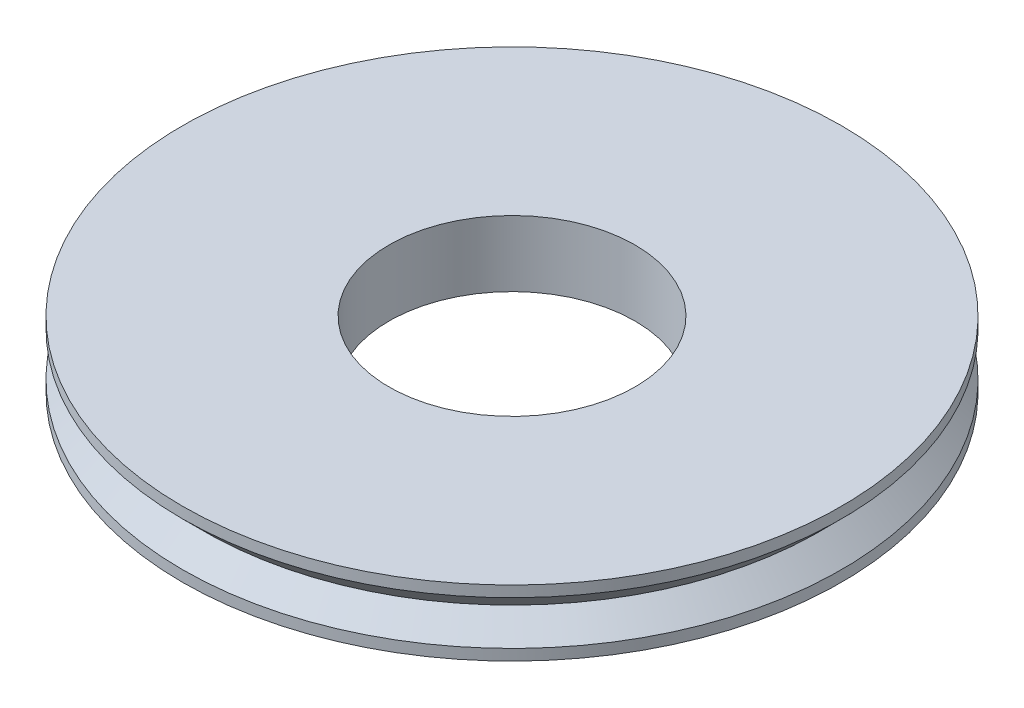
ISO-10303-21;
HEADER;
FILE_DESCRIPTION(('STEP AP214'),'2;1');
FILE_NAME('part.step','',(''),(''),'','','');
FILE_SCHEMA(('AUTOMOTIVE_DESIGN { 1 0 10303 214 1 1 1 1 }'));
ENDSEC;
DATA;
#1=APPLICATION_CONTEXT('core data for automotive mechanical design processes');
#2=APPLICATION_PROTOCOL_DEFINITION('international standard','automotive_design',2000,#1);
#3=PRODUCT_CONTEXT('',#1,'mechanical');
#4=PRODUCT('Part','Part','',(#3));
#5=PRODUCT_RELATED_PRODUCT_CATEGORY('part','',(#4));
#6=PRODUCT_DEFINITION_FORMATION('','',#4);
#7=PRODUCT_DEFINITION_CONTEXT('part definition',#1,'design');
#8=PRODUCT_DEFINITION('design','',#6,#7);
#9=PRODUCT_DEFINITION_SHAPE('','',#8);
#10=(LENGTH_UNIT() NAMED_UNIT(*) SI_UNIT(.MILLI.,.METRE.));
#11=(NAMED_UNIT(*) PLANE_ANGLE_UNIT() SI_UNIT($,.RADIAN.));
#12=(NAMED_UNIT(*) SI_UNIT($,.STERADIAN.) SOLID_ANGLE_UNIT());
#13=UNCERTAINTY_MEASURE_WITH_UNIT(LENGTH_MEASURE(1.E-05),#10,'distance_accuracy_value','');
#14=(GEOMETRIC_REPRESENTATION_CONTEXT(3) GLOBAL_UNCERTAINTY_ASSIGNED_CONTEXT((#13)) GLOBAL_UNIT_ASSIGNED_CONTEXT((#10,
#11,#12)) REPRESENTATION_CONTEXT('',''));
#15=CARTESIAN_POINT('',(0.,0.,0.));
#16=DIRECTION('',(0.,0.,1.));
#17=DIRECTION('',(1.,0.,0.));
#18=AXIS2_PLACEMENT_3D('',#15,#16,#17);
#19=CARTESIAN_POINT('',(-5.6,0.,0.));
#20=DIRECTION('',(0.,1.,0.));
#21=DIRECTION('',(0.,0.,1.));
#22=AXIS2_PLACEMENT_3D('',#19,#20,#21);
#23=PLANE('',#22);
#24=CARTESIAN_POINT('',(0.,0.,0.));
#25=DIRECTION('',(0.,-1.,0.));
#26=DIRECTION('',(0.,0.,-1.));
#27=AXIS2_PLACEMENT_3D('',#24,#25,#26);
#28=CIRCLE('',#27,5.6);
#29=CARTESIAN_POINT('',(0.,0.,-5.6));
#30=VERTEX_POINT('',#29);
#31=EDGE_CURVE('E10',#30,#30,#28,.T.);
#32=ORIENTED_EDGE('',*,*,#31,.F.);
#33=EDGE_LOOP('',(#32));
#34=FACE_BOUND('',#33,.T.);
#35=CARTESIAN_POINT('',(0.,0.,0.));
#36=DIRECTION('',(0.,-1.,0.));
#37=DIRECTION('',(0.,0.,-1.));
#38=AXIS2_PLACEMENT_3D('',#35,#36,#37);
#39=CIRCLE('',#38,15.);
#40=CARTESIAN_POINT('',(0.,0.,-15.));
#41=VERTEX_POINT('',#40);
#42=EDGE_CURVE('E68',#41,#41,#39,.T.);
#43=ORIENTED_EDGE('',*,*,#42,.T.);
#44=EDGE_LOOP('',(#43));
#45=FACE_BOUND('',#44,.T.);
#46=ADVANCED_FACE('F37',(#34,#45),#23,.F.);
#47=CARTESIAN_POINT('',(0.,0.,0.));
#48=DIRECTION('',(0.,-1.,0.));
#49=DIRECTION('',(0.,0.,-1.));
#50=AXIS2_PLACEMENT_3D('',#47,#48,#49);
#51=CYLINDRICAL_SURFACE('',#50,5.6);
#52=CARTESIAN_POINT('',(0.,3.,0.));
#53=DIRECTION('',(0.,-1.,0.));
#54=DIRECTION('',(0.,0.,-1.));
#55=AXIS2_PLACEMENT_3D('',#52,#53,#54);
#56=CIRCLE('',#55,5.6);
#57=CARTESIAN_POINT('',(0.,3.,-5.6));
#58=VERTEX_POINT('',#57);
#59=EDGE_CURVE('E44',#58,#58,#56,.T.);
#60=ORIENTED_EDGE('',*,*,#59,.F.);
#61=EDGE_LOOP('',(#60));
#62=FACE_BOUND('',#61,.T.);
#63=ORIENTED_EDGE('',*,*,#31,.T.);
#64=EDGE_LOOP('',(#63));
#65=FACE_BOUND('',#64,.T.);
#66=ADVANCED_FACE('F100',(#62,#65),#51,.F.);
#67=CARTESIAN_POINT('',(-5.6,3.,0.));
#68=DIRECTION('',(0.,-1.,0.));
#69=DIRECTION('',(0.,0.,-1.));
#70=AXIS2_PLACEMENT_3D('',#67,#68,#69);
#71=PLANE('',#70);
#72=CARTESIAN_POINT('',(0.,3.,0.));
#73=DIRECTION('',(0.,-1.,0.));
#74=DIRECTION('',(0.,0.,-1.));
#75=AXIS2_PLACEMENT_3D('',#72,#73,#74);
#76=CIRCLE('',#75,15.);
#77=CARTESIAN_POINT('',(0.,3.,-15.));
#78=VERTEX_POINT('',#77);
#79=EDGE_CURVE('E49',#78,#78,#76,.T.);
#80=ORIENTED_EDGE('',*,*,#79,.F.);
#81=EDGE_LOOP('',(#80));
#82=FACE_BOUND('',#81,.T.);
#83=ORIENTED_EDGE('',*,*,#59,.T.);
#84=EDGE_LOOP('',(#83));
#85=FACE_BOUND('',#84,.T.);
#86=ADVANCED_FACE('F95',(#82,#85),#71,.F.);
#87=CARTESIAN_POINT('',(0.,0.,0.));
#88=DIRECTION('',(0.,-1.,0.));
#89=DIRECTION('',(0.,0.,-1.));
#90=AXIS2_PLACEMENT_3D('',#87,#88,#89);
#91=CYLINDRICAL_SURFACE('',#90,15.);
#92=CARTESIAN_POINT('',(0.,2.5,0.));
#93=DIRECTION('',(0.,-1.,0.));
#94=DIRECTION('',(0.,0.,-1.));
#95=AXIS2_PLACEMENT_3D('',#92,#93,#94);
#96=CIRCLE('',#95,15.);
#97=CARTESIAN_POINT('',(0.,2.5,-15.));
#98=VERTEX_POINT('',#97);
#99=EDGE_CURVE('E54',#98,#98,#96,.T.);
#100=ORIENTED_EDGE('',*,*,#99,.F.);
#101=EDGE_LOOP('',(#100));
#102=FACE_BOUND('',#101,.T.);
#103=ORIENTED_EDGE('',*,*,#79,.T.);
#104=EDGE_LOOP('',(#103));
#105=FACE_BOUND('',#104,.T.);
#106=ADVANCED_FACE('F89',(#102,#105),#91,.T.);
#107=CARTESIAN_POINT('',(0.,2.5,0.));
#108=DIRECTION('',(0.,1.,0.));
#109=DIRECTION('',(0.,0.,1.));
#110=AXIS2_PLACEMENT_3D('',#107,#108,#109);
#111=CONICAL_SURFACE('',#110,15.,0.785398163397449);
#112=CARTESIAN_POINT('',(0.,1.5,0.));
#113=DIRECTION('',(0.,-1.,0.));
#114=DIRECTION('',(0.,0.,-1.));
#115=AXIS2_PLACEMENT_3D('',#112,#113,#114);
#116=CIRCLE('',#115,14.);
#117=CARTESIAN_POINT('',(0.,1.5,-14.));
#118=VERTEX_POINT('',#117);
#119=EDGE_CURVE('E60',#118,#118,#116,.T.);
#120=ORIENTED_EDGE('',*,*,#119,.F.);
#121=EDGE_LOOP('',(#120));
#122=FACE_BOUND('',#121,.T.);
#123=ORIENTED_EDGE('',*,*,#99,.T.);
#124=EDGE_LOOP('',(#123));
#125=FACE_BOUND('',#124,.T.);
#126=ADVANCED_FACE('F83',(#122,#125),#111,.T.);
#127=CARTESIAN_POINT('',(0.,1.5,0.));
#128=DIRECTION('',(0.,-1.,0.));
#129=DIRECTION('',(0.,0.,-1.));
#130=AXIS2_PLACEMENT_3D('',#127,#128,#129);
#131=CONICAL_SURFACE('',#130,14.,0.785398163397449);
#132=CARTESIAN_POINT('',(0.,0.499999999999999,0.));
#133=DIRECTION('',(0.,-1.,0.));
#134=DIRECTION('',(0.,0.,-1.));
#135=AXIS2_PLACEMENT_3D('',#132,#133,#134);
#136=CIRCLE('',#135,15.);
#137=CARTESIAN_POINT('',(0.,0.499999999999999,-15.));
#138=VERTEX_POINT('',#137);
#139=EDGE_CURVE('E64',#138,#138,#136,.T.);
#140=ORIENTED_EDGE('',*,*,#139,.F.);
#141=EDGE_LOOP('',(#140));
#142=FACE_BOUND('',#141,.T.);
#143=ORIENTED_EDGE('',*,*,#119,.T.);
#144=EDGE_LOOP('',(#143));
#145=FACE_BOUND('',#144,.T.);
#146=ADVANCED_FACE('F77',(#142,#145),#131,.T.);
#147=CARTESIAN_POINT('',(0.,0.,0.));
#148=DIRECTION('',(0.,-1.,0.));
#149=DIRECTION('',(0.,0.,-1.));
#150=AXIS2_PLACEMENT_3D('',#147,#148,#149);
#151=CYLINDRICAL_SURFACE('',#150,15.);
#152=ORIENTED_EDGE('',*,*,#42,.F.);
#153=EDGE_LOOP('',(#152));
#154=FACE_BOUND('',#153,.T.);
#155=ORIENTED_EDGE('',*,*,#139,.T.);
#156=EDGE_LOOP('',(#155));
#157=FACE_BOUND('',#156,.T.);
#158=ADVANCED_FACE('F74',(#154,#157),#151,.T.);
#159=CLOSED_SHELL('',(#46,#66,#86,#106,#126,#146,#158));
#160=MANIFOLD_SOLID_BREP('B2',#159);
#161=ADVANCED_BREP_SHAPE_REPRESENTATION('',(#18,#160),#14);
#162=SHAPE_DEFINITION_REPRESENTATION(#9,#161);
ENDSEC;
END-ISO-10303-21;
